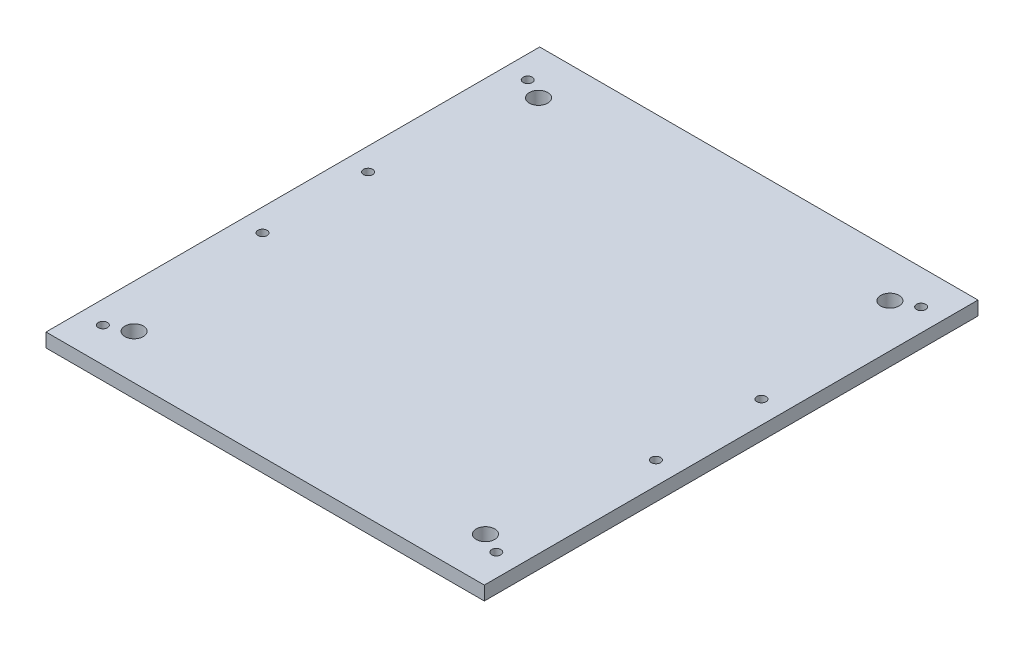
ISO-10303-21;
HEADER;
FILE_DESCRIPTION(('STEP AP214'),'2;1');
FILE_NAME('part.step','',(''),(''),'','','');
FILE_SCHEMA(('AUTOMOTIVE_DESIGN { 1 0 10303 214 1 1 1 1 }'));
ENDSEC;
DATA;
#1=APPLICATION_CONTEXT('core data for automotive mechanical design processes');
#2=APPLICATION_PROTOCOL_DEFINITION('international standard','automotive_design',2000,#1);
#3=PRODUCT_CONTEXT('',#1,'mechanical');
#4=PRODUCT('Part','Part','',(#3));
#5=PRODUCT_RELATED_PRODUCT_CATEGORY('part','',(#4));
#6=PRODUCT_DEFINITION_FORMATION('','',#4);
#7=PRODUCT_DEFINITION_CONTEXT('part definition',#1,'design');
#8=PRODUCT_DEFINITION('design','',#6,#7);
#9=PRODUCT_DEFINITION_SHAPE('','',#8);
#10=(LENGTH_UNIT() NAMED_UNIT(*) SI_UNIT(.MILLI.,.METRE.));
#11=(NAMED_UNIT(*) PLANE_ANGLE_UNIT() SI_UNIT($,.RADIAN.));
#12=(NAMED_UNIT(*) SI_UNIT($,.STERADIAN.) SOLID_ANGLE_UNIT());
#13=UNCERTAINTY_MEASURE_WITH_UNIT(LENGTH_MEASURE(1.E-05),#10,'distance_accuracy_value','');
#14=(GEOMETRIC_REPRESENTATION_CONTEXT(3) GLOBAL_UNCERTAINTY_ASSIGNED_CONTEXT((#13)) GLOBAL_UNIT_ASSIGNED_CONTEXT((#10,
#11,#12)) REPRESENTATION_CONTEXT('',''));
#15=CARTESIAN_POINT('',(0.,0.,0.));
#16=DIRECTION('',(0.,0.,1.));
#17=DIRECTION('',(1.,0.,0.));
#18=AXIS2_PLACEMENT_3D('',#15,#16,#17);
#19=CARTESIAN_POINT('',(0.,3.,53.5));
#20=DIRECTION('',(0.,0.,-1.));
#21=DIRECTION('',(-1.,0.,0.));
#22=AXIS2_PLACEMENT_3D('',#19,#20,#21);
#23=PLANE('',#22);
#24=DIRECTION('',(1.,0.,0.));
#25=VECTOR('',#24,1.);
#26=CARTESIAN_POINT('',(0.,0.,53.5));
#27=LINE('',#26,#25);
#28=CARTESIAN_POINT('',(-47.5,0.,53.5));
#29=VERTEX_POINT('',#28);
#30=CARTESIAN_POINT('',(47.5,0.,53.5));
#31=VERTEX_POINT('',#30);
#32=EDGE_CURVE('E118',#29,#31,#27,.T.);
#33=ORIENTED_EDGE('',*,*,#32,.T.);
#34=DIRECTION('',(0.,-1.,0.));
#35=VECTOR('',#34,1.);
#36=CARTESIAN_POINT('',(47.5,3.,53.5));
#37=LINE('',#36,#35);
#38=CARTESIAN_POINT('',(47.5,3.,53.5));
#39=VERTEX_POINT('',#38);
#40=EDGE_CURVE('E11',#39,#31,#37,.T.);
#41=ORIENTED_EDGE('',*,*,#40,.F.);
#42=DIRECTION('',(1.,0.,0.));
#43=VECTOR('',#42,1.);
#44=CARTESIAN_POINT('',(0.,3.,53.5));
#45=LINE('',#44,#43);
#46=CARTESIAN_POINT('',(-47.5,3.,53.5));
#47=VERTEX_POINT('',#46);
#48=EDGE_CURVE('E90',#47,#39,#45,.T.);
#49=ORIENTED_EDGE('',*,*,#48,.F.);
#50=DIRECTION('',(0.,-1.,0.));
#51=VECTOR('',#50,1.);
#52=CARTESIAN_POINT('',(-47.5,3.,53.5));
#53=LINE('',#52,#51);
#54=EDGE_CURVE('E56',#47,#29,#53,.T.);
#55=ORIENTED_EDGE('',*,*,#54,.T.);
#56=EDGE_LOOP('',(#33,#41,#49,#55));
#57=FACE_BOUND('',#56,.T.);
#58=ADVANCED_FACE('F37',(#57),#23,.F.);
#59=CARTESIAN_POINT('',(47.5,3.,0.));
#60=DIRECTION('',(-1.,0.,0.));
#61=DIRECTION('',(0.,0.,1.));
#62=AXIS2_PLACEMENT_3D('',#59,#60,#61);
#63=PLANE('',#62);
#64=DIRECTION('',(0.,0.,-1.));
#65=VECTOR('',#64,1.);
#66=CARTESIAN_POINT('',(47.5,0.,0.));
#67=LINE('',#66,#65);
#68=CARTESIAN_POINT('',(47.5,0.,-53.5));
#69=VERTEX_POINT('',#68);
#70=EDGE_CURVE('E95',#31,#69,#67,.T.);
#71=ORIENTED_EDGE('',*,*,#70,.T.);
#72=DIRECTION('',(0.,-1.,0.));
#73=VECTOR('',#72,1.);
#74=CARTESIAN_POINT('',(47.5,3.,-53.5));
#75=LINE('',#74,#73);
#76=CARTESIAN_POINT('',(47.5,3.,-53.5));
#77=VERTEX_POINT('',#76);
#78=EDGE_CURVE('E47',#77,#69,#75,.T.);
#79=ORIENTED_EDGE('',*,*,#78,.F.);
#80=DIRECTION('',(0.,0.,-1.));
#81=VECTOR('',#80,1.);
#82=CARTESIAN_POINT('',(47.5,3.,0.));
#83=LINE('',#82,#81);
#84=EDGE_CURVE('E81',#39,#77,#83,.T.);
#85=ORIENTED_EDGE('',*,*,#84,.F.);
#86=ORIENTED_EDGE('',*,*,#40,.T.);
#87=EDGE_LOOP('',(#71,#79,#85,#86));
#88=FACE_BOUND('',#87,.T.);
#89=ADVANCED_FACE('F94',(#88),#63,.F.);
#90=CARTESIAN_POINT('',(0.,3.,-53.5));
#91=DIRECTION('',(0.,0.,-1.));
#92=DIRECTION('',(-1.,0.,0.));
#93=AXIS2_PLACEMENT_3D('',#90,#91,#92);
#94=PLANE('',#93);
#95=DIRECTION('',(1.,0.,0.));
#96=VECTOR('',#95,1.);
#97=CARTESIAN_POINT('',(0.,0.,-53.5));
#98=LINE('',#97,#96);
#99=CARTESIAN_POINT('',(-47.5,0.,-53.5));
#100=VERTEX_POINT('',#99);
#101=EDGE_CURVE('E121',#100,#69,#98,.T.);
#102=ORIENTED_EDGE('',*,*,#101,.F.);
#103=DIRECTION('',(0.,-1.,0.));
#104=VECTOR('',#103,1.);
#105=CARTESIAN_POINT('',(-47.5,3.,-53.5));
#106=LINE('',#105,#104);
#107=CARTESIAN_POINT('',(-47.5,3.,-53.5));
#108=VERTEX_POINT('',#107);
#109=EDGE_CURVE('E70',#108,#100,#106,.T.);
#110=ORIENTED_EDGE('',*,*,#109,.F.);
#111=DIRECTION('',(1.,0.,0.));
#112=VECTOR('',#111,1.);
#113=CARTESIAN_POINT('',(0.,3.,-53.5));
#114=LINE('',#113,#112);
#115=EDGE_CURVE('E89',#108,#77,#114,.T.);
#116=ORIENTED_EDGE('',*,*,#115,.T.);
#117=ORIENTED_EDGE('',*,*,#78,.T.);
#118=EDGE_LOOP('',(#102,#110,#116,#117));
#119=FACE_BOUND('',#118,.T.);
#120=ADVANCED_FACE('F99',(#119),#94,.T.);
#121=CARTESIAN_POINT('',(-47.5,3.,0.));
#122=DIRECTION('',(-1.,0.,0.));
#123=DIRECTION('',(0.,0.,1.));
#124=AXIS2_PLACEMENT_3D('',#121,#122,#123);
#125=PLANE('',#124);
#126=DIRECTION('',(0.,0.,-1.));
#127=VECTOR('',#126,1.);
#128=CARTESIAN_POINT('',(-47.5,0.,0.));
#129=LINE('',#128,#127);
#130=EDGE_CURVE('E123',#29,#100,#129,.T.);
#131=ORIENTED_EDGE('',*,*,#130,.F.);
#132=ORIENTED_EDGE('',*,*,#54,.F.);
#133=DIRECTION('',(0.,0.,-1.));
#134=VECTOR('',#133,1.);
#135=CARTESIAN_POINT('',(-47.5,3.,0.));
#136=LINE('',#135,#134);
#137=EDGE_CURVE('E100',#47,#108,#136,.T.);
#138=ORIENTED_EDGE('',*,*,#137,.T.);
#139=ORIENTED_EDGE('',*,*,#109,.T.);
#140=EDGE_LOOP('',(#131,#132,#138,#139));
#141=FACE_BOUND('',#140,.T.);
#142=ADVANCED_FACE('F218',(#141),#125,.T.);
#143=CARTESIAN_POINT('',(38.075,3.,43.825));
#144=DIRECTION('',(0.,-1.,0.));
#145=DIRECTION('',(0.,0.,-1.));
#146=AXIS2_PLACEMENT_3D('',#143,#144,#145);
#147=CYLINDRICAL_SURFACE('',#146,2.);
#148=CARTESIAN_POINT('',(38.075,3.,43.825));
#149=DIRECTION('',(0.,1.,0.));
#150=DIRECTION('',(0.,0.,1.));
#151=AXIS2_PLACEMENT_3D('',#148,#149,#150);
#152=CIRCLE('',#151,2.);
#153=CARTESIAN_POINT('',(38.075,3.,45.825));
#154=VERTEX_POINT('',#153);
#155=EDGE_CURVE('E184',#154,#154,#152,.T.);
#156=ORIENTED_EDGE('',*,*,#155,.T.);
#157=EDGE_LOOP('',(#156));
#158=FACE_BOUND('',#157,.T.);
#159=CARTESIAN_POINT('',(38.075,0.,43.825));
#160=DIRECTION('',(0.,1.,0.));
#161=DIRECTION('',(0.,0.,1.));
#162=AXIS2_PLACEMENT_3D('',#159,#160,#161);
#163=CIRCLE('',#162,2.);
#164=CARTESIAN_POINT('',(38.075,0.,45.825));
#165=VERTEX_POINT('',#164);
#166=EDGE_CURVE('E115',#165,#165,#163,.T.);
#167=ORIENTED_EDGE('',*,*,#166,.F.);
#168=EDGE_LOOP('',(#167));
#169=FACE_BOUND('',#168,.T.);
#170=ADVANCED_FACE('F188',(#158,#169),#147,.F.);
#171=CARTESIAN_POINT('',(38.075,3.,-43.825));
#172=DIRECTION('',(0.,-1.,0.));
#173=DIRECTION('',(0.,0.,-1.));
#174=AXIS2_PLACEMENT_3D('',#171,#172,#173);
#175=CYLINDRICAL_SURFACE('',#174,2.);
#176=CARTESIAN_POINT('',(38.075,3.,-43.825));
#177=DIRECTION('',(0.,1.,0.));
#178=DIRECTION('',(0.,0.,1.));
#179=AXIS2_PLACEMENT_3D('',#176,#177,#178);
#180=CIRCLE('',#179,2.);
#181=CARTESIAN_POINT('',(38.075,3.,-41.825));
#182=VERTEX_POINT('',#181);
#183=EDGE_CURVE('E181',#182,#182,#180,.F.);
#184=ORIENTED_EDGE('',*,*,#183,.F.);
#185=EDGE_LOOP('',(#184));
#186=FACE_BOUND('',#185,.T.);
#187=CARTESIAN_POINT('',(38.075,0.,-43.825));
#188=DIRECTION('',(0.,1.,0.));
#189=DIRECTION('',(0.,0.,1.));
#190=AXIS2_PLACEMENT_3D('',#187,#188,#189);
#191=CIRCLE('',#190,2.);
#192=CARTESIAN_POINT('',(38.075,0.,-41.825));
#193=VERTEX_POINT('',#192);
#194=EDGE_CURVE('E111',#193,#193,#191,.F.);
#195=ORIENTED_EDGE('',*,*,#194,.T.);
#196=EDGE_LOOP('',(#195));
#197=FACE_BOUND('',#196,.T.);
#198=ADVANCED_FACE('F217',(#186,#197),#175,.F.);
#199=CARTESIAN_POINT('',(-38.075,3.,-43.825));
#200=DIRECTION('',(0.,-1.,0.));
#201=DIRECTION('',(0.,0.,-1.));
#202=AXIS2_PLACEMENT_3D('',#199,#200,#201);
#203=CYLINDRICAL_SURFACE('',#202,2.);
#204=CARTESIAN_POINT('',(-38.075,3.,-43.825));
#205=DIRECTION('',(0.,1.,0.));
#206=DIRECTION('',(0.,0.,1.));
#207=AXIS2_PLACEMENT_3D('',#204,#205,#206);
#208=CIRCLE('',#207,2.);
#209=CARTESIAN_POINT('',(-38.075,3.,-41.825));
#210=VERTEX_POINT('',#209);
#211=EDGE_CURVE('E129',#210,#210,#208,.T.);
#212=ORIENTED_EDGE('',*,*,#211,.T.);
#213=EDGE_LOOP('',(#212));
#214=FACE_BOUND('',#213,.T.);
#215=CARTESIAN_POINT('',(-38.075,0.,-43.825));
#216=DIRECTION('',(0.,1.,0.));
#217=DIRECTION('',(0.,0.,1.));
#218=AXIS2_PLACEMENT_3D('',#215,#216,#217);
#219=CIRCLE('',#218,2.);
#220=CARTESIAN_POINT('',(-38.075,0.,-41.825));
#221=VERTEX_POINT('',#220);
#222=EDGE_CURVE('E108',#221,#221,#219,.T.);
#223=ORIENTED_EDGE('',*,*,#222,.F.);
#224=EDGE_LOOP('',(#223));
#225=FACE_BOUND('',#224,.T.);
#226=ADVANCED_FACE('F39',(#214,#225),#203,.F.);
#227=CARTESIAN_POINT('',(-38.075,3.,43.825));
#228=DIRECTION('',(0.,-1.,0.));
#229=DIRECTION('',(0.,0.,-1.));
#230=AXIS2_PLACEMENT_3D('',#227,#228,#229);
#231=CYLINDRICAL_SURFACE('',#230,2.);
#232=CARTESIAN_POINT('',(-38.075,3.,43.825));
#233=DIRECTION('',(0.,1.,0.));
#234=DIRECTION('',(0.,0.,1.));
#235=AXIS2_PLACEMENT_3D('',#232,#233,#234);
#236=CIRCLE('',#235,2.);
#237=CARTESIAN_POINT('',(-38.075,3.,45.825));
#238=VERTEX_POINT('',#237);
#239=EDGE_CURVE('E102',#238,#238,#236,.F.);
#240=ORIENTED_EDGE('',*,*,#239,.F.);
#241=EDGE_LOOP('',(#240));
#242=FACE_BOUND('',#241,.T.);
#243=CARTESIAN_POINT('',(-38.075,0.,43.825));
#244=DIRECTION('',(0.,1.,0.));
#245=DIRECTION('',(0.,0.,1.));
#246=AXIS2_PLACEMENT_3D('',#243,#244,#245);
#247=CIRCLE('',#246,2.);
#248=CARTESIAN_POINT('',(-38.075,0.,45.825));
#249=VERTEX_POINT('',#248);
#250=EDGE_CURVE('E126',#249,#249,#247,.F.);
#251=ORIENTED_EDGE('',*,*,#250,.T.);
#252=EDGE_LOOP('',(#251));
#253=FACE_BOUND('',#252,.T.);
#254=ADVANCED_FACE('F193',(#242,#253),#231,.F.);
#255=CARTESIAN_POINT('',(0.,3.,0.));
#256=DIRECTION('',(0.,1.,0.));
#257=DIRECTION('',(0.,0.,1.));
#258=AXIS2_PLACEMENT_3D('',#255,#256,#257);
#259=PLANE('',#258);
#260=CARTESIAN_POINT('',(-42.63,3.,11.4372225515878));
#261=DIRECTION('',(0.,-1.,0.));
#262=DIRECTION('',(0.,0.,1.));
#263=AXIS2_PLACEMENT_3D('',#260,#261,#262);
#264=CIRCLE('',#263,0.999999999999998);
#265=CARTESIAN_POINT('',(-42.63,3.,12.4372225515878));
#266=VERTEX_POINT('',#265);
#267=EDGE_CURVE('E166',#266,#266,#264,.T.);
#268=ORIENTED_EDGE('',*,*,#267,.T.);
#269=EDGE_LOOP('',(#268));
#270=FACE_BOUND('',#269,.T.);
#271=CARTESIAN_POINT('',(-42.63,3.,-11.4372225515878));
#272=DIRECTION('',(0.,1.,0.));
#273=DIRECTION('',(0.,0.,-1.));
#274=AXIS2_PLACEMENT_3D('',#271,#272,#273);
#275=CIRCLE('',#274,0.999999999999998);
#276=CARTESIAN_POINT('',(-42.63,3.,-12.4372225515878));
#277=VERTEX_POINT('',#276);
#278=EDGE_CURVE('E156',#277,#277,#275,.T.);
#279=ORIENTED_EDGE('',*,*,#278,.F.);
#280=EDGE_LOOP('',(#279));
#281=FACE_BOUND('',#280,.T.);
#282=CARTESIAN_POINT('',(42.63,3.,11.4372225515878));
#283=DIRECTION('',(0.,1.,0.));
#284=DIRECTION('',(0.,0.,1.));
#285=AXIS2_PLACEMENT_3D('',#282,#283,#284);
#286=CIRCLE('',#285,0.999999999999998);
#287=CARTESIAN_POINT('',(42.63,3.,12.4372225515878));
#288=VERTEX_POINT('',#287);
#289=EDGE_CURVE('E153',#288,#288,#286,.T.);
#290=ORIENTED_EDGE('',*,*,#289,.F.);
#291=EDGE_LOOP('',(#290));
#292=FACE_BOUND('',#291,.T.);
#293=CARTESIAN_POINT('',(-42.63,3.,46.04));
#294=DIRECTION('',(0.,1.,0.));
#295=DIRECTION('',(0.,0.,-1.));
#296=AXIS2_PLACEMENT_3D('',#293,#294,#295);
#297=CIRCLE('',#296,0.999999999999998);
#298=CARTESIAN_POINT('',(-42.63,3.,45.04));
#299=VERTEX_POINT('',#298);
#300=EDGE_CURVE('E150',#299,#299,#297,.T.);
#301=ORIENTED_EDGE('',*,*,#300,.F.);
#302=EDGE_LOOP('',(#301));
#303=FACE_BOUND('',#302,.T.);
#304=CARTESIAN_POINT('',(-42.63,3.,-46.04));
#305=DIRECTION('',(0.,-1.,0.));
#306=DIRECTION('',(0.,0.,1.));
#307=AXIS2_PLACEMENT_3D('',#304,#305,#306);
#308=CIRCLE('',#307,0.999999999999998);
#309=CARTESIAN_POINT('',(-42.63,3.,-45.04));
#310=VERTEX_POINT('',#309);
#311=EDGE_CURVE('E146',#310,#310,#308,.T.);
#312=ORIENTED_EDGE('',*,*,#311,.T.);
#313=EDGE_LOOP('',(#312));
#314=FACE_BOUND('',#313,.T.);
#315=CARTESIAN_POINT('',(42.63,3.,46.04));
#316=DIRECTION('',(0.,-1.,0.));
#317=DIRECTION('',(0.,0.,-1.));
#318=AXIS2_PLACEMENT_3D('',#315,#316,#317);
#319=CIRCLE('',#318,0.999999999999998);
#320=CARTESIAN_POINT('',(42.63,3.,45.04));
#321=VERTEX_POINT('',#320);
#322=EDGE_CURVE('E142',#321,#321,#319,.T.);
#323=ORIENTED_EDGE('',*,*,#322,.T.);
#324=EDGE_LOOP('',(#323));
#325=FACE_BOUND('',#324,.T.);
#326=CARTESIAN_POINT('',(42.63,3.,-11.4372225515878));
#327=DIRECTION('',(0.,-1.,0.));
#328=DIRECTION('',(0.,0.,-1.));
#329=AXIS2_PLACEMENT_3D('',#326,#327,#328);
#330=CIRCLE('',#329,0.999999999999998);
#331=CARTESIAN_POINT('',(42.63,3.,-12.4372225515878));
#332=VERTEX_POINT('',#331);
#333=EDGE_CURVE('E138',#332,#332,#330,.T.);
#334=ORIENTED_EDGE('',*,*,#333,.T.);
#335=EDGE_LOOP('',(#334));
#336=FACE_BOUND('',#335,.T.);
#337=CARTESIAN_POINT('',(42.63,3.,-46.04));
#338=DIRECTION('',(0.,1.,0.));
#339=DIRECTION('',(0.,0.,1.));
#340=AXIS2_PLACEMENT_3D('',#337,#338,#339);
#341=CIRCLE('',#340,0.999999999999998);
#342=CARTESIAN_POINT('',(42.63,3.,-45.04));
#343=VERTEX_POINT('',#342);
#344=EDGE_CURVE('E134',#343,#343,#341,.T.);
#345=ORIENTED_EDGE('',*,*,#344,.F.);
#346=EDGE_LOOP('',(#345));
#347=FACE_BOUND('',#346,.T.);
#348=ORIENTED_EDGE('',*,*,#211,.F.);
#349=EDGE_LOOP('',(#348));
#350=FACE_BOUND('',#349,.T.);
#351=ORIENTED_EDGE('',*,*,#183,.T.);
#352=EDGE_LOOP('',(#351));
#353=FACE_BOUND('',#352,.T.);
#354=ORIENTED_EDGE('',*,*,#155,.F.);
#355=EDGE_LOOP('',(#354));
#356=FACE_BOUND('',#355,.T.);
#357=ORIENTED_EDGE('',*,*,#48,.T.);
#358=ORIENTED_EDGE('',*,*,#84,.T.);
#359=ORIENTED_EDGE('',*,*,#115,.F.);
#360=ORIENTED_EDGE('',*,*,#137,.F.);
#361=EDGE_LOOP('',(#357,#358,#359,#360));
#362=FACE_BOUND('',#361,.T.);
#363=ORIENTED_EDGE('',*,*,#239,.T.);
#364=EDGE_LOOP('',(#363));
#365=FACE_BOUND('',#364,.T.);
#366=ADVANCED_FACE('F85',(#270,#281,#292,#303,#314,#325,#336,#347,#350,#353,#356,#362,#365),
#259,.T.);
#367=CARTESIAN_POINT('',(0.,0.,0.));
#368=DIRECTION('',(0.,1.,0.));
#369=DIRECTION('',(0.,0.,1.));
#370=AXIS2_PLACEMENT_3D('',#367,#368,#369);
#371=PLANE('',#370);
#372=CARTESIAN_POINT('',(-42.63,0.,11.4372225515878));
#373=DIRECTION('',(0.,1.,0.));
#374=DIRECTION('',(0.,0.,1.));
#375=AXIS2_PLACEMENT_3D('',#372,#373,#374);
#376=CIRCLE('',#375,0.999999999999998);
#377=CARTESIAN_POINT('',(-42.63,0.,12.4372225515878));
#378=VERTEX_POINT('',#377);
#379=EDGE_CURVE('E41',#378,#378,#376,.F.);
#380=ORIENTED_EDGE('',*,*,#379,.F.);
#381=EDGE_LOOP('',(#380));
#382=FACE_BOUND('',#381,.T.);
#383=CARTESIAN_POINT('',(-42.63,0.,-11.4372225515878));
#384=DIRECTION('',(0.,1.,0.));
#385=DIRECTION('',(0.,0.,1.));
#386=AXIS2_PLACEMENT_3D('',#383,#384,#385);
#387=CIRCLE('',#386,0.999999999999998);
#388=CARTESIAN_POINT('',(-42.63,0.,-10.4372225515878));
#389=VERTEX_POINT('',#388);
#390=EDGE_CURVE('E154',#389,#389,#387,.T.);
#391=ORIENTED_EDGE('',*,*,#390,.T.);
#392=EDGE_LOOP('',(#391));
#393=FACE_BOUND('',#392,.T.);
#394=CARTESIAN_POINT('',(42.63,0.,11.4372225515878));
#395=DIRECTION('',(0.,1.,0.));
#396=DIRECTION('',(0.,0.,1.));
#397=AXIS2_PLACEMENT_3D('',#394,#395,#396);
#398=CIRCLE('',#397,0.999999999999998);
#399=CARTESIAN_POINT('',(42.63,0.,12.4372225515878));
#400=VERTEX_POINT('',#399);
#401=EDGE_CURVE('E151',#400,#400,#398,.T.);
#402=ORIENTED_EDGE('',*,*,#401,.T.);
#403=EDGE_LOOP('',(#402));
#404=FACE_BOUND('',#403,.T.);
#405=CARTESIAN_POINT('',(-42.63,0.,46.04));
#406=DIRECTION('',(0.,1.,0.));
#407=DIRECTION('',(0.,0.,1.));
#408=AXIS2_PLACEMENT_3D('',#405,#406,#407);
#409=CIRCLE('',#408,0.999999999999998);
#410=CARTESIAN_POINT('',(-42.63,0.,47.04));
#411=VERTEX_POINT('',#410);
#412=EDGE_CURVE('E147',#411,#411,#409,.T.);
#413=ORIENTED_EDGE('',*,*,#412,.T.);
#414=EDGE_LOOP('',(#413));
#415=FACE_BOUND('',#414,.T.);
#416=CARTESIAN_POINT('',(-42.63,0.,-46.04));
#417=DIRECTION('',(0.,1.,0.));
#418=DIRECTION('',(0.,0.,1.));
#419=AXIS2_PLACEMENT_3D('',#416,#417,#418);
#420=CIRCLE('',#419,0.999999999999998);
#421=CARTESIAN_POINT('',(-42.63,0.,-45.04));
#422=VERTEX_POINT('',#421);
#423=EDGE_CURVE('E143',#422,#422,#420,.F.);
#424=ORIENTED_EDGE('',*,*,#423,.F.);
#425=EDGE_LOOP('',(#424));
#426=FACE_BOUND('',#425,.T.);
#427=CARTESIAN_POINT('',(42.63,0.,46.04));
#428=DIRECTION('',(0.,1.,0.));
#429=DIRECTION('',(0.,0.,1.));
#430=AXIS2_PLACEMENT_3D('',#427,#428,#429);
#431=CIRCLE('',#430,0.999999999999998);
#432=CARTESIAN_POINT('',(42.63,0.,47.04));
#433=VERTEX_POINT('',#432);
#434=EDGE_CURVE('E139',#433,#433,#431,.F.);
#435=ORIENTED_EDGE('',*,*,#434,.F.);
#436=EDGE_LOOP('',(#435));
#437=FACE_BOUND('',#436,.T.);
#438=CARTESIAN_POINT('',(42.63,0.,-11.4372225515878));
#439=DIRECTION('',(0.,1.,0.));
#440=DIRECTION('',(0.,0.,1.));
#441=AXIS2_PLACEMENT_3D('',#438,#439,#440);
#442=CIRCLE('',#441,0.999999999999998);
#443=CARTESIAN_POINT('',(42.63,0.,-10.4372225515878));
#444=VERTEX_POINT('',#443);
#445=EDGE_CURVE('E135',#444,#444,#442,.F.);
#446=ORIENTED_EDGE('',*,*,#445,.F.);
#447=EDGE_LOOP('',(#446));
#448=FACE_BOUND('',#447,.T.);
#449=CARTESIAN_POINT('',(42.63,0.,-46.04));
#450=DIRECTION('',(0.,1.,0.));
#451=DIRECTION('',(0.,0.,1.));
#452=AXIS2_PLACEMENT_3D('',#449,#450,#451);
#453=CIRCLE('',#452,0.999999999999998);
#454=CARTESIAN_POINT('',(42.63,0.,-45.04));
#455=VERTEX_POINT('',#454);
#456=EDGE_CURVE('E112',#455,#455,#453,.T.);
#457=ORIENTED_EDGE('',*,*,#456,.T.);
#458=EDGE_LOOP('',(#457));
#459=FACE_BOUND('',#458,.T.);
#460=ORIENTED_EDGE('',*,*,#222,.T.);
#461=EDGE_LOOP('',(#460));
#462=FACE_BOUND('',#461,.T.);
#463=ORIENTED_EDGE('',*,*,#194,.F.);
#464=EDGE_LOOP('',(#463));
#465=FACE_BOUND('',#464,.T.);
#466=ORIENTED_EDGE('',*,*,#166,.T.);
#467=EDGE_LOOP('',(#466));
#468=FACE_BOUND('',#467,.T.);
#469=ORIENTED_EDGE('',*,*,#32,.F.);
#470=ORIENTED_EDGE('',*,*,#130,.T.);
#471=ORIENTED_EDGE('',*,*,#101,.T.);
#472=ORIENTED_EDGE('',*,*,#70,.F.);
#473=EDGE_LOOP('',(#469,#470,#471,#472));
#474=FACE_BOUND('',#473,.T.);
#475=ORIENTED_EDGE('',*,*,#250,.F.);
#476=EDGE_LOOP('',(#475));
#477=FACE_BOUND('',#476,.T.);
#478=ADVANCED_FACE('F192',(#382,#393,#404,#415,#426,#437,#448,#459,#462,#465,#468,#474,#477),
#371,.F.);
#479=CARTESIAN_POINT('',(42.63,-7.,-46.04));
#480=DIRECTION('',(0.,1.,0.));
#481=DIRECTION('',(0.,0.,1.));
#482=AXIS2_PLACEMENT_3D('',#479,#480,#481);
#483=CYLINDRICAL_SURFACE('',#482,0.999999999999998);
#484=ORIENTED_EDGE('',*,*,#344,.T.);
#485=EDGE_LOOP('',(#484));
#486=FACE_BOUND('',#485,.T.);
#487=ORIENTED_EDGE('',*,*,#456,.F.);
#488=EDGE_LOOP('',(#487));
#489=FACE_BOUND('',#488,.T.);
#490=ADVANCED_FACE('F200',(#486,#489),#483,.F.);
#491=CARTESIAN_POINT('',(42.63,-7.,-11.4372225515878));
#492=DIRECTION('',(0.,1.,0.));
#493=DIRECTION('',(0.,0.,1.));
#494=AXIS2_PLACEMENT_3D('',#491,#492,#493);
#495=CYLINDRICAL_SURFACE('',#494,0.999999999999998);
#496=ORIENTED_EDGE('',*,*,#333,.F.);
#497=EDGE_LOOP('',(#496));
#498=FACE_BOUND('',#497,.T.);
#499=ORIENTED_EDGE('',*,*,#445,.T.);
#500=EDGE_LOOP('',(#499));
#501=FACE_BOUND('',#500,.T.);
#502=ADVANCED_FACE('F302',(#498,#501),#495,.F.);
#503=CARTESIAN_POINT('',(42.63,-7.,46.04));
#504=DIRECTION('',(0.,1.,0.));
#505=DIRECTION('',(0.,0.,1.));
#506=AXIS2_PLACEMENT_3D('',#503,#504,#505);
#507=CYLINDRICAL_SURFACE('',#506,0.999999999999998);
#508=ORIENTED_EDGE('',*,*,#322,.F.);
#509=EDGE_LOOP('',(#508));
#510=FACE_BOUND('',#509,.T.);
#511=ORIENTED_EDGE('',*,*,#434,.T.);
#512=EDGE_LOOP('',(#511));
#513=FACE_BOUND('',#512,.T.);
#514=ADVANCED_FACE('F309',(#510,#513),#507,.F.);
#515=CARTESIAN_POINT('',(-42.63,-7.,-46.04));
#516=DIRECTION('',(0.,1.,0.));
#517=DIRECTION('',(0.,0.,1.));
#518=AXIS2_PLACEMENT_3D('',#515,#516,#517);
#519=CYLINDRICAL_SURFACE('',#518,0.999999999999998);
#520=ORIENTED_EDGE('',*,*,#311,.F.);
#521=EDGE_LOOP('',(#520));
#522=FACE_BOUND('',#521,.T.);
#523=ORIENTED_EDGE('',*,*,#423,.T.);
#524=EDGE_LOOP('',(#523));
#525=FACE_BOUND('',#524,.T.);
#526=ADVANCED_FACE('F317',(#522,#525),#519,.F.);
#527=CARTESIAN_POINT('',(-42.63,-7.,46.04));
#528=DIRECTION('',(0.,1.,0.));
#529=DIRECTION('',(0.,0.,1.));
#530=AXIS2_PLACEMENT_3D('',#527,#528,#529);
#531=CYLINDRICAL_SURFACE('',#530,0.999999999999998);
#532=ORIENTED_EDGE('',*,*,#300,.T.);
#533=EDGE_LOOP('',(#532));
#534=FACE_BOUND('',#533,.T.);
#535=ORIENTED_EDGE('',*,*,#412,.F.);
#536=EDGE_LOOP('',(#535));
#537=FACE_BOUND('',#536,.T.);
#538=ADVANCED_FACE('F326',(#534,#537),#531,.F.);
#539=CARTESIAN_POINT('',(42.63,-7.,11.4372225515878));
#540=DIRECTION('',(0.,1.,0.));
#541=DIRECTION('',(0.,0.,1.));
#542=AXIS2_PLACEMENT_3D('',#539,#540,#541);
#543=CYLINDRICAL_SURFACE('',#542,0.999999999999998);
#544=ORIENTED_EDGE('',*,*,#289,.T.);
#545=EDGE_LOOP('',(#544));
#546=FACE_BOUND('',#545,.T.);
#547=ORIENTED_EDGE('',*,*,#401,.F.);
#548=EDGE_LOOP('',(#547));
#549=FACE_BOUND('',#548,.T.);
#550=ADVANCED_FACE('F335',(#546,#549),#543,.F.);
#551=CARTESIAN_POINT('',(-42.63,-7.,-11.4372225515878));
#552=DIRECTION('',(0.,1.,0.));
#553=DIRECTION('',(0.,0.,1.));
#554=AXIS2_PLACEMENT_3D('',#551,#552,#553);
#555=CYLINDRICAL_SURFACE('',#554,0.999999999999998);
#556=ORIENTED_EDGE('',*,*,#278,.T.);
#557=EDGE_LOOP('',(#556));
#558=FACE_BOUND('',#557,.T.);
#559=ORIENTED_EDGE('',*,*,#390,.F.);
#560=EDGE_LOOP('',(#559));
#561=FACE_BOUND('',#560,.T.);
#562=ADVANCED_FACE('F344',(#558,#561),#555,.F.);
#563=CARTESIAN_POINT('',(-42.63,-7.,11.4372225515878));
#564=DIRECTION('',(0.,1.,0.));
#565=DIRECTION('',(0.,0.,1.));
#566=AXIS2_PLACEMENT_3D('',#563,#564,#565);
#567=CYLINDRICAL_SURFACE('',#566,0.999999999999998);
#568=ORIENTED_EDGE('',*,*,#267,.F.);
#569=EDGE_LOOP('',(#568));
#570=FACE_BOUND('',#569,.T.);
#571=ORIENTED_EDGE('',*,*,#379,.T.);
#572=EDGE_LOOP('',(#571));
#573=FACE_BOUND('',#572,.T.);
#574=ADVANCED_FACE('F353',(#570,#573),#567,.F.);
#575=CLOSED_SHELL('',(#58,#89,#120,#142,#170,#198,#226,#254,#366,#478,#490,#502,#514,#526,#538,
#550,#562,#574));
#576=MANIFOLD_SOLID_BREP('B2',#575);
#577=ADVANCED_BREP_SHAPE_REPRESENTATION('',(#18,#576),#14);
#578=SHAPE_DEFINITION_REPRESENTATION(#9,#577);
ENDSEC;
END-ISO-10303-21;
